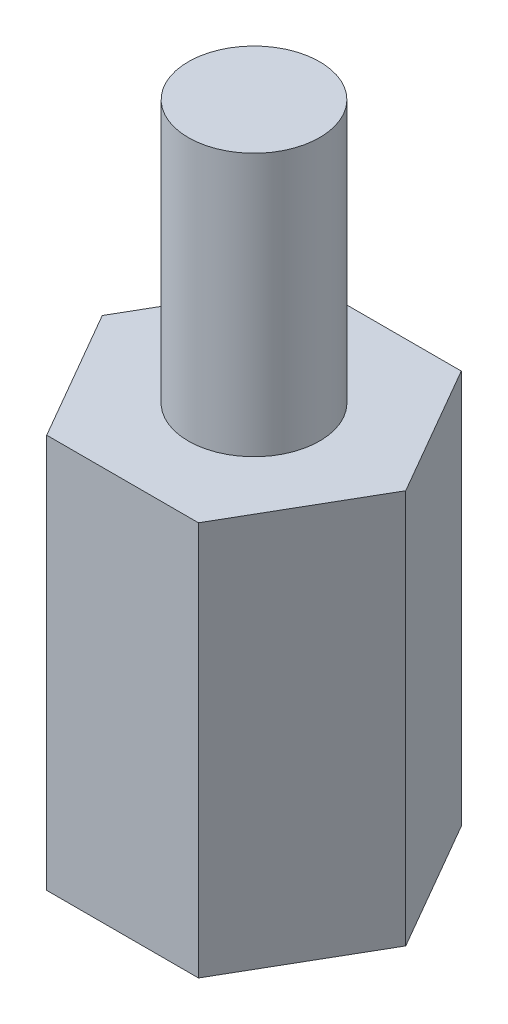
ISO-10303-21;
HEADER;
FILE_DESCRIPTION(('STEP AP214'),'2;1');
FILE_NAME('part.step','',(''),(''),'','','');
FILE_SCHEMA(('AUTOMOTIVE_DESIGN { 1 0 10303 214 1 1 1 1 }'));
ENDSEC;
DATA;
#1=APPLICATION_CONTEXT('core data for automotive mechanical design processes');
#2=APPLICATION_PROTOCOL_DEFINITION('international standard','automotive_design',2000,#1);
#3=PRODUCT_CONTEXT('',#1,'mechanical');
#4=PRODUCT('Part','Part','',(#3));
#5=PRODUCT_RELATED_PRODUCT_CATEGORY('part','',(#4));
#6=PRODUCT_DEFINITION_FORMATION('','',#4);
#7=PRODUCT_DEFINITION_CONTEXT('part definition',#1,'design');
#8=PRODUCT_DEFINITION('design','',#6,#7);
#9=PRODUCT_DEFINITION_SHAPE('','',#8);
#10=(LENGTH_UNIT() NAMED_UNIT(*) SI_UNIT(.MILLI.,.METRE.));
#11=(NAMED_UNIT(*) PLANE_ANGLE_UNIT() SI_UNIT($,.RADIAN.));
#12=(NAMED_UNIT(*) SI_UNIT($,.STERADIAN.) SOLID_ANGLE_UNIT());
#13=UNCERTAINTY_MEASURE_WITH_UNIT(LENGTH_MEASURE(1.E-05),#10,'distance_accuracy_value','');
#14=(GEOMETRIC_REPRESENTATION_CONTEXT(3) GLOBAL_UNCERTAINTY_ASSIGNED_CONTEXT((#13)) GLOBAL_UNIT_ASSIGNED_CONTEXT((#10,
#11,#12)) REPRESENTATION_CONTEXT('',''));
#15=CARTESIAN_POINT('',(0.,0.,0.));
#16=DIRECTION('',(0.,0.,1.));
#17=DIRECTION('',(1.,0.,0.));
#18=AXIS2_PLACEMENT_3D('',#15,#16,#17);
#19=CARTESIAN_POINT('',(1.15470053837925,6.,2.));
#20=DIRECTION('',(-0.866025403784439,0.,-0.5));
#21=DIRECTION('',(-0.5,0.,0.866025403784439));
#22=AXIS2_PLACEMENT_3D('',#19,#20,#21);
#23=PLANE('',#22);
#24=DIRECTION('',(0.5,0.,-0.866025403784439));
#25=VECTOR('',#24,1.);
#26=CARTESIAN_POINT('',(1.15470053837925,0.,2.));
#27=LINE('',#26,#25);
#28=CARTESIAN_POINT('',(1.15470053837925,0.,2.));
#29=VERTEX_POINT('',#28);
#30=CARTESIAN_POINT('',(2.3094010767585,0.,0.));
#31=VERTEX_POINT('',#30);
#32=EDGE_CURVE('E121',#29,#31,#27,.T.);
#33=ORIENTED_EDGE('',*,*,#32,.T.);
#34=DIRECTION('',(0.,-1.,0.));
#35=VECTOR('',#34,1.);
#36=CARTESIAN_POINT('',(2.3094010767585,6.,0.));
#37=LINE('',#36,#35);
#38=CARTESIAN_POINT('',(2.3094010767585,6.,0.));
#39=VERTEX_POINT('',#38);
#40=EDGE_CURVE('E38',#39,#31,#37,.T.);
#41=ORIENTED_EDGE('',*,*,#40,.F.);
#42=DIRECTION('',(0.5,0.,-0.866025403784439));
#43=VECTOR('',#42,1.);
#44=CARTESIAN_POINT('',(1.15470053837925,6.,2.));
#45=LINE('',#44,#43);
#46=CARTESIAN_POINT('',(1.15470053837925,6.,2.));
#47=VERTEX_POINT('',#46);
#48=EDGE_CURVE('E132',#47,#39,#45,.T.);
#49=ORIENTED_EDGE('',*,*,#48,.F.);
#50=DIRECTION('',(0.,-1.,0.));
#51=VECTOR('',#50,1.);
#52=CARTESIAN_POINT('',(1.15470053837925,6.,2.));
#53=LINE('',#52,#51);
#54=EDGE_CURVE('E117',#47,#29,#53,.T.);
#55=ORIENTED_EDGE('',*,*,#54,.T.);
#56=EDGE_LOOP('',(#33,#41,#49,#55));
#57=FACE_BOUND('',#56,.T.);
#58=ADVANCED_FACE('F35',(#57),#23,.F.);
#59=CARTESIAN_POINT('',(2.3094010767585,6.,0.));
#60=DIRECTION('',(-0.866025403784438,0.,0.5));
#61=DIRECTION('',(0.5,0.,0.866025403784439));
#62=AXIS2_PLACEMENT_3D('',#59,#60,#61);
#63=PLANE('',#62);
#64=DIRECTION('',(-0.5,0.,-0.866025403784438));
#65=VECTOR('',#64,1.);
#66=CARTESIAN_POINT('',(2.3094010767585,0.,0.));
#67=LINE('',#66,#65);
#68=CARTESIAN_POINT('',(1.15470053837925,0.,-2.));
#69=VERTEX_POINT('',#68);
#70=EDGE_CURVE('E124',#31,#69,#67,.T.);
#71=ORIENTED_EDGE('',*,*,#70,.T.);
#72=DIRECTION('',(0.,-1.,0.));
#73=VECTOR('',#72,1.);
#74=CARTESIAN_POINT('',(1.15470053837925,6.,-2.));
#75=LINE('',#74,#73);
#76=CARTESIAN_POINT('',(1.15470053837925,6.,-2.));
#77=VERTEX_POINT('',#76);
#78=EDGE_CURVE('E135',#77,#69,#75,.T.);
#79=ORIENTED_EDGE('',*,*,#78,.F.);
#80=DIRECTION('',(-0.5,0.,-0.866025403784438));
#81=VECTOR('',#80,1.);
#82=CARTESIAN_POINT('',(2.3094010767585,6.,0.));
#83=LINE('',#82,#81);
#84=EDGE_CURVE('E90',#39,#77,#83,.T.);
#85=ORIENTED_EDGE('',*,*,#84,.F.);
#86=ORIENTED_EDGE('',*,*,#40,.T.);
#87=EDGE_LOOP('',(#71,#79,#85,#86));
#88=FACE_BOUND('',#87,.T.);
#89=ADVANCED_FACE('F140',(#88),#63,.F.);
#90=CARTESIAN_POINT('',(1.15470053837925,6.,-2.));
#91=DIRECTION('',(0.,0.,1.));
#92=DIRECTION('',(1.,0.,0.));
#93=AXIS2_PLACEMENT_3D('',#90,#91,#92);
#94=PLANE('',#93);
#95=DIRECTION('',(-1.,0.,0.));
#96=VECTOR('',#95,1.);
#97=CARTESIAN_POINT('',(1.15470053837925,0.,-2.));
#98=LINE('',#97,#96);
#99=CARTESIAN_POINT('',(-1.15470053837925,0.,-2.));
#100=VERTEX_POINT('',#99);
#101=EDGE_CURVE('E127',#69,#100,#98,.T.);
#102=ORIENTED_EDGE('',*,*,#101,.T.);
#103=DIRECTION('',(0.,-1.,0.));
#104=VECTOR('',#103,1.);
#105=CARTESIAN_POINT('',(-1.15470053837925,6.,-2.));
#106=LINE('',#105,#104);
#107=CARTESIAN_POINT('',(-1.15470053837925,6.,-2.));
#108=VERTEX_POINT('',#107);
#109=EDGE_CURVE('E112',#108,#100,#106,.T.);
#110=ORIENTED_EDGE('',*,*,#109,.F.);
#111=DIRECTION('',(-1.,0.,0.));
#112=VECTOR('',#111,1.);
#113=CARTESIAN_POINT('',(1.15470053837925,6.,-2.));
#114=LINE('',#113,#112);
#115=EDGE_CURVE('E103',#77,#108,#114,.T.);
#116=ORIENTED_EDGE('',*,*,#115,.F.);
#117=ORIENTED_EDGE('',*,*,#78,.T.);
#118=EDGE_LOOP('',(#102,#110,#116,#117));
#119=FACE_BOUND('',#118,.T.);
#120=ADVANCED_FACE('F146',(#119),#94,.F.);
#121=CARTESIAN_POINT('',(-1.15470053837925,6.,-2.));
#122=DIRECTION('',(0.866025403784439,0.,0.5));
#123=DIRECTION('',(0.5,0.,-0.866025403784439));
#124=AXIS2_PLACEMENT_3D('',#121,#122,#123);
#125=PLANE('',#124);
#126=DIRECTION('',(-0.5,0.,0.866025403784438));
#127=VECTOR('',#126,1.);
#128=CARTESIAN_POINT('',(-1.15470053837925,0.,-2.));
#129=LINE('',#128,#127);
#130=CARTESIAN_POINT('',(-2.3094010767585,0.,0.));
#131=VERTEX_POINT('',#130);
#132=EDGE_CURVE('E111',#100,#131,#129,.T.);
#133=ORIENTED_EDGE('',*,*,#132,.T.);
#134=DIRECTION('',(0.,-1.,0.));
#135=VECTOR('',#134,1.);
#136=CARTESIAN_POINT('',(-2.3094010767585,6.,0.));
#137=LINE('',#136,#135);
#138=CARTESIAN_POINT('',(-2.3094010767585,6.,0.));
#139=VERTEX_POINT('',#138);
#140=EDGE_CURVE('E108',#139,#131,#137,.T.);
#141=ORIENTED_EDGE('',*,*,#140,.F.);
#142=DIRECTION('',(-0.5,0.,0.866025403784438));
#143=VECTOR('',#142,1.);
#144=CARTESIAN_POINT('',(-1.15470053837925,6.,-2.));
#145=LINE('',#144,#143);
#146=EDGE_CURVE('E97',#108,#139,#145,.T.);
#147=ORIENTED_EDGE('',*,*,#146,.F.);
#148=ORIENTED_EDGE('',*,*,#109,.T.);
#149=EDGE_LOOP('',(#133,#141,#147,#148));
#150=FACE_BOUND('',#149,.T.);
#151=ADVANCED_FACE('F109',(#150),#125,.F.);
#152=CARTESIAN_POINT('',(-2.3094010767585,6.,0.));
#153=DIRECTION('',(0.866025403784439,0.,-0.5));
#154=DIRECTION('',(-0.5,0.,-0.866025403784439));
#155=AXIS2_PLACEMENT_3D('',#152,#153,#154);
#156=PLANE('',#155);
#157=DIRECTION('',(0.5,0.,0.866025403784438));
#158=VECTOR('',#157,1.);
#159=CARTESIAN_POINT('',(-2.3094010767585,0.,0.));
#160=LINE('',#159,#158);
#161=CARTESIAN_POINT('',(-1.15470053837925,0.,2.));
#162=VERTEX_POINT('',#161);
#163=EDGE_CURVE('E75',#131,#162,#160,.T.);
#164=ORIENTED_EDGE('',*,*,#163,.T.);
#165=DIRECTION('',(0.,-1.,0.));
#166=VECTOR('',#165,1.);
#167=CARTESIAN_POINT('',(-1.15470053837925,6.,2.));
#168=LINE('',#167,#166);
#169=CARTESIAN_POINT('',(-1.15470053837925,6.,2.));
#170=VERTEX_POINT('',#169);
#171=EDGE_CURVE('E113',#170,#162,#168,.T.);
#172=ORIENTED_EDGE('',*,*,#171,.F.);
#173=DIRECTION('',(0.5,0.,0.866025403784438));
#174=VECTOR('',#173,1.);
#175=CARTESIAN_POINT('',(-2.3094010767585,6.,0.));
#176=LINE('',#175,#174);
#177=EDGE_CURVE('E101',#139,#170,#176,.T.);
#178=ORIENTED_EDGE('',*,*,#177,.F.);
#179=ORIENTED_EDGE('',*,*,#140,.T.);
#180=EDGE_LOOP('',(#164,#172,#178,#179));
#181=FACE_BOUND('',#180,.T.);
#182=ADVANCED_FACE('F115',(#181),#156,.F.);
#183=CARTESIAN_POINT('',(-1.15470053837925,6.,2.));
#184=DIRECTION('',(0.,0.,-1.));
#185=DIRECTION('',(-1.,0.,0.));
#186=AXIS2_PLACEMENT_3D('',#183,#184,#185);
#187=PLANE('',#186);
#188=DIRECTION('',(1.,0.,0.));
#189=VECTOR('',#188,1.);
#190=CARTESIAN_POINT('',(-1.15470053837925,0.,2.));
#191=LINE('',#190,#189);
#192=EDGE_CURVE('E81',#162,#29,#191,.T.);
#193=ORIENTED_EDGE('',*,*,#192,.T.);
#194=ORIENTED_EDGE('',*,*,#54,.F.);
#195=DIRECTION('',(1.,0.,0.));
#196=VECTOR('',#195,1.);
#197=CARTESIAN_POINT('',(-1.15470053837925,6.,2.));
#198=LINE('',#197,#196);
#199=EDGE_CURVE('E52',#170,#47,#198,.T.);
#200=ORIENTED_EDGE('',*,*,#199,.F.);
#201=ORIENTED_EDGE('',*,*,#171,.T.);
#202=EDGE_LOOP('',(#193,#194,#200,#201));
#203=FACE_BOUND('',#202,.T.);
#204=ADVANCED_FACE('F177',(#203),#187,.F.);
#205=CARTESIAN_POINT('',(0.,6.,0.));
#206=DIRECTION('',(0.,1.,0.));
#207=DIRECTION('',(0.,0.,1.));
#208=AXIS2_PLACEMENT_3D('',#205,#206,#207);
#209=PLANE('',#208);
#210=CARTESIAN_POINT('',(0.,6.,0.));
#211=DIRECTION('',(0.,1.,0.));
#212=DIRECTION('',(0.,0.,1.));
#213=AXIS2_PLACEMENT_3D('',#210,#211,#212);
#214=CIRCLE('',#213,1.);
#215=CARTESIAN_POINT('',(0.,6.,1.));
#216=VERTEX_POINT('',#215);
#217=EDGE_CURVE('E11',#216,#216,#214,.T.);
#218=ORIENTED_EDGE('',*,*,#217,.F.);
#219=EDGE_LOOP('',(#218));
#220=FACE_BOUND('',#219,.T.);
#221=ORIENTED_EDGE('',*,*,#48,.T.);
#222=ORIENTED_EDGE('',*,*,#84,.T.);
#223=ORIENTED_EDGE('',*,*,#115,.T.);
#224=ORIENTED_EDGE('',*,*,#146,.T.);
#225=ORIENTED_EDGE('',*,*,#177,.T.);
#226=ORIENTED_EDGE('',*,*,#199,.T.);
#227=EDGE_LOOP('',(#221,#222,#223,#224,#225,#226));
#228=FACE_BOUND('',#227,.T.);
#229=ADVANCED_FACE('F99',(#220,#228),#209,.T.);
#230=CARTESIAN_POINT('',(0.,0.,0.));
#231=DIRECTION('',(0.,1.,0.));
#232=DIRECTION('',(0.,0.,1.));
#233=AXIS2_PLACEMENT_3D('',#230,#231,#232);
#234=PLANE('',#233);
#235=CARTESIAN_POINT('',(0.,0.,0.));
#236=DIRECTION('',(0.,-1.,0.));
#237=DIRECTION('',(0.,0.,-1.));
#238=AXIS2_PLACEMENT_3D('',#235,#236,#237);
#239=CIRCLE('',#238,1.);
#240=CARTESIAN_POINT('',(0.,0.,-1.));
#241=VERTEX_POINT('',#240);
#242=EDGE_CURVE('E153',#241,#241,#239,.T.);
#243=ORIENTED_EDGE('',*,*,#242,.F.);
#244=EDGE_LOOP('',(#243));
#245=FACE_BOUND('',#244,.T.);
#246=ORIENTED_EDGE('',*,*,#32,.F.);
#247=ORIENTED_EDGE('',*,*,#192,.F.);
#248=ORIENTED_EDGE('',*,*,#163,.F.);
#249=ORIENTED_EDGE('',*,*,#132,.F.);
#250=ORIENTED_EDGE('',*,*,#101,.F.);
#251=ORIENTED_EDGE('',*,*,#70,.F.);
#252=EDGE_LOOP('',(#246,#247,#248,#249,#250,#251));
#253=FACE_BOUND('',#252,.T.);
#254=ADVANCED_FACE('F145',(#245,#253),#234,.F.);
#255=CARTESIAN_POINT('',(0.,10.,0.));
#256=DIRECTION('',(0.,-1.,0.));
#257=DIRECTION('',(0.,0.,-1.));
#258=AXIS2_PLACEMENT_3D('',#255,#256,#257);
#259=CYLINDRICAL_SURFACE('',#258,1.);
#260=CARTESIAN_POINT('',(0.,10.,0.));
#261=DIRECTION('',(0.,1.,0.));
#262=DIRECTION('',(0.,0.,1.));
#263=AXIS2_PLACEMENT_3D('',#260,#261,#262);
#264=CIRCLE('',#263,1.);
#265=CARTESIAN_POINT('',(0.,10.,1.));
#266=VERTEX_POINT('',#265);
#267=EDGE_CURVE('E125',#266,#266,#264,.T.);
#268=ORIENTED_EDGE('',*,*,#267,.F.);
#269=EDGE_LOOP('',(#268));
#270=FACE_BOUND('',#269,.T.);
#271=ORIENTED_EDGE('',*,*,#217,.T.);
#272=EDGE_LOOP('',(#271));
#273=FACE_BOUND('',#272,.T.);
#274=ADVANCED_FACE('F169',(#270,#273),#259,.T.);
#275=CARTESIAN_POINT('',(0.,10.,0.));
#276=DIRECTION('',(0.,1.,0.));
#277=DIRECTION('',(0.,0.,1.));
#278=AXIS2_PLACEMENT_3D('',#275,#276,#277);
#279=PLANE('',#278);
#280=ORIENTED_EDGE('',*,*,#267,.T.);
#281=EDGE_LOOP('',(#280));
#282=FACE_BOUND('',#281,.T.);
#283=ADVANCED_FACE('F164',(#282),#279,.T.);
#284=CARTESIAN_POINT('',(0.,4.,0.));
#285=DIRECTION('',(0.,-1.,0.));
#286=DIRECTION('',(0.,0.,-1.));
#287=AXIS2_PLACEMENT_3D('',#284,#285,#286);
#288=CYLINDRICAL_SURFACE('',#287,1.);
#289=CARTESIAN_POINT('',(0.,4.,0.));
#290=DIRECTION('',(0.,-1.,0.));
#291=DIRECTION('',(0.,0.,-1.));
#292=AXIS2_PLACEMENT_3D('',#289,#290,#291);
#293=CIRCLE('',#292,1.);
#294=CARTESIAN_POINT('',(0.,4.,-1.));
#295=VERTEX_POINT('',#294);
#296=EDGE_CURVE('E152',#295,#295,#293,.T.);
#297=ORIENTED_EDGE('',*,*,#296,.F.);
#298=EDGE_LOOP('',(#297));
#299=FACE_BOUND('',#298,.T.);
#300=ORIENTED_EDGE('',*,*,#242,.T.);
#301=EDGE_LOOP('',(#300));
#302=FACE_BOUND('',#301,.T.);
#303=ADVANCED_FACE('F161',(#299,#302),#288,.F.);
#304=CARTESIAN_POINT('',(0.,4.,0.));
#305=DIRECTION('',(0.,-1.,0.));
#306=DIRECTION('',(0.,0.,-1.));
#307=AXIS2_PLACEMENT_3D('',#304,#305,#306);
#308=PLANE('',#307);
#309=ORIENTED_EDGE('',*,*,#296,.T.);
#310=EDGE_LOOP('',(#309));
#311=FACE_BOUND('',#310,.T.);
#312=ADVANCED_FACE('F159',(#311),#308,.T.);
#313=CLOSED_SHELL('',(#58,#89,#120,#151,#182,#204,#229,#254,#274,#283,#303,#312));
#314=MANIFOLD_SOLID_BREP('B2',#313);
#315=ADVANCED_BREP_SHAPE_REPRESENTATION('',(#18,#314),#14);
#316=SHAPE_DEFINITION_REPRESENTATION(#9,#315);
ENDSEC;
END-ISO-10303-21;
